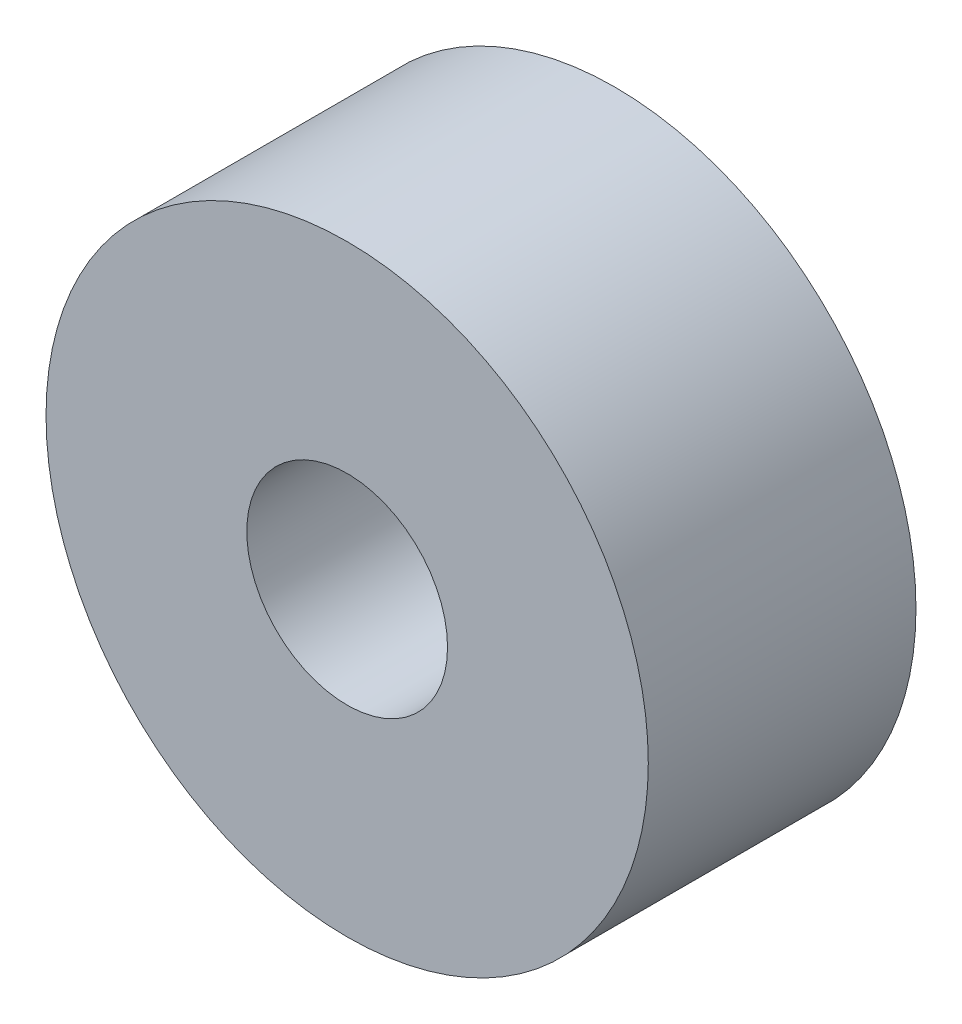
ISO-10303-21;
HEADER;
FILE_DESCRIPTION(('STEP AP214'),'2;1');
FILE_NAME('part.step','',(''),(''),'','','');
FILE_SCHEMA(('AUTOMOTIVE_DESIGN { 1 0 10303 214 1 1 1 1 }'));
ENDSEC;
DATA;
#1=APPLICATION_CONTEXT('core data for automotive mechanical design processes');
#2=APPLICATION_PROTOCOL_DEFINITION('international standard','automotive_design',2000,#1);
#3=PRODUCT_CONTEXT('',#1,'mechanical');
#4=PRODUCT('Part','Part','',(#3));
#5=PRODUCT_RELATED_PRODUCT_CATEGORY('part','',(#4));
#6=PRODUCT_DEFINITION_FORMATION('','',#4);
#7=PRODUCT_DEFINITION_CONTEXT('part definition',#1,'design');
#8=PRODUCT_DEFINITION('design','',#6,#7);
#9=PRODUCT_DEFINITION_SHAPE('','',#8);
#10=(LENGTH_UNIT() NAMED_UNIT(*) SI_UNIT(.MILLI.,.METRE.));
#11=(NAMED_UNIT(*) PLANE_ANGLE_UNIT() SI_UNIT($,.RADIAN.));
#12=(NAMED_UNIT(*) SI_UNIT($,.STERADIAN.) SOLID_ANGLE_UNIT());
#13=UNCERTAINTY_MEASURE_WITH_UNIT(LENGTH_MEASURE(1.E-05),#10,'distance_accuracy_value','');
#14=(GEOMETRIC_REPRESENTATION_CONTEXT(3) GLOBAL_UNCERTAINTY_ASSIGNED_CONTEXT((#13)) GLOBAL_UNIT_ASSIGNED_CONTEXT((#10,
#11,#12)) REPRESENTATION_CONTEXT('',''));
#15=CARTESIAN_POINT('',(0.,0.,0.));
#16=DIRECTION('',(0.,0.,1.));
#17=DIRECTION('',(1.,0.,0.));
#18=AXIS2_PLACEMENT_3D('',#15,#16,#17);
#19=CARTESIAN_POINT('',(0.,0.,2.));
#20=DIRECTION('',(0.,0.,1.));
#21=DIRECTION('',(1.,0.,0.));
#22=AXIS2_PLACEMENT_3D('',#19,#20,#21);
#23=PLANE('',#22);
#24=CARTESIAN_POINT('',(0.,0.,2.));
#25=DIRECTION('',(0.,0.,1.));
#26=DIRECTION('',(1.,0.,0.));
#27=AXIS2_PLACEMENT_3D('',#24,#25,#26);
#28=CIRCLE('',#27,4.5);
#29=CARTESIAN_POINT('',(4.5,0.,2.));
#30=VERTEX_POINT('',#29);
#31=EDGE_CURVE('E10',#30,#30,#28,.T.);
#32=ORIENTED_EDGE('',*,*,#31,.T.);
#33=EDGE_LOOP('',(#32));
#34=FACE_BOUND('',#33,.T.);
#35=CARTESIAN_POINT('',(0.,0.,2.));
#36=DIRECTION('',(0.,0.,1.));
#37=DIRECTION('',(1.,0.,0.));
#38=AXIS2_PLACEMENT_3D('',#35,#36,#37);
#39=CIRCLE('',#38,1.5);
#40=CARTESIAN_POINT('',(1.5,0.,2.));
#41=VERTEX_POINT('',#40);
#42=EDGE_CURVE('E45',#41,#41,#39,.T.);
#43=ORIENTED_EDGE('',*,*,#42,.F.);
#44=EDGE_LOOP('',(#43));
#45=FACE_BOUND('',#44,.T.);
#46=ADVANCED_FACE('F34',(#34,#45),#23,.T.);
#47=CARTESIAN_POINT('',(0.,0.,-2.));
#48=DIRECTION('',(0.,0.,1.));
#49=DIRECTION('',(1.,0.,0.));
#50=AXIS2_PLACEMENT_3D('',#47,#48,#49);
#51=PLANE('',#50);
#52=CARTESIAN_POINT('',(0.,0.,-2.));
#53=DIRECTION('',(0.,0.,1.));
#54=DIRECTION('',(1.,0.,0.));
#55=AXIS2_PLACEMENT_3D('',#52,#53,#54);
#56=CIRCLE('',#55,4.5);
#57=CARTESIAN_POINT('',(4.5,0.,-2.));
#58=VERTEX_POINT('',#57);
#59=EDGE_CURVE('E38',#58,#58,#56,.T.);
#60=ORIENTED_EDGE('',*,*,#59,.F.);
#61=EDGE_LOOP('',(#60));
#62=FACE_BOUND('',#61,.T.);
#63=CARTESIAN_POINT('',(0.,0.,-2.));
#64=DIRECTION('',(0.,0.,1.));
#65=DIRECTION('',(1.,0.,0.));
#66=AXIS2_PLACEMENT_3D('',#63,#64,#65);
#67=CIRCLE('',#66,1.5);
#68=CARTESIAN_POINT('',(1.5,0.,-2.));
#69=VERTEX_POINT('',#68);
#70=EDGE_CURVE('E47',#69,#69,#67,.T.);
#71=ORIENTED_EDGE('',*,*,#70,.T.);
#72=EDGE_LOOP('',(#71));
#73=FACE_BOUND('',#72,.T.);
#74=ADVANCED_FACE('F57',(#62,#73),#51,.F.);
#75=CARTESIAN_POINT('',(0.,0.,2.));
#76=DIRECTION('',(0.,0.,-1.));
#77=DIRECTION('',(-1.,0.,0.));
#78=AXIS2_PLACEMENT_3D('',#75,#76,#77);
#79=CYLINDRICAL_SURFACE('',#78,4.5);
#80=ORIENTED_EDGE('',*,*,#31,.F.);
#81=EDGE_LOOP('',(#80));
#82=FACE_BOUND('',#81,.T.);
#83=ORIENTED_EDGE('',*,*,#59,.T.);
#84=EDGE_LOOP('',(#83));
#85=FACE_BOUND('',#84,.T.);
#86=ADVANCED_FACE('F36',(#82,#85),#79,.T.);
#87=CARTESIAN_POINT('',(0.,0.,2.));
#88=DIRECTION('',(0.,0.,-1.));
#89=DIRECTION('',(-1.,0.,0.));
#90=AXIS2_PLACEMENT_3D('',#87,#88,#89);
#91=CYLINDRICAL_SURFACE('',#90,1.5);
#92=ORIENTED_EDGE('',*,*,#42,.T.);
#93=EDGE_LOOP('',(#92));
#94=FACE_BOUND('',#93,.T.);
#95=ORIENTED_EDGE('',*,*,#70,.F.);
#96=EDGE_LOOP('',(#95));
#97=FACE_BOUND('',#96,.T.);
#98=ADVANCED_FACE('F53',(#94,#97),#91,.F.);
#99=CLOSED_SHELL('',(#46,#74,#86,#98));
#100=MANIFOLD_SOLID_BREP('B2',#99);
#101=ADVANCED_BREP_SHAPE_REPRESENTATION('',(#18,#100),#14);
#102=SHAPE_DEFINITION_REPRESENTATION(#9,#101);
ENDSEC;
END-ISO-10303-21;
